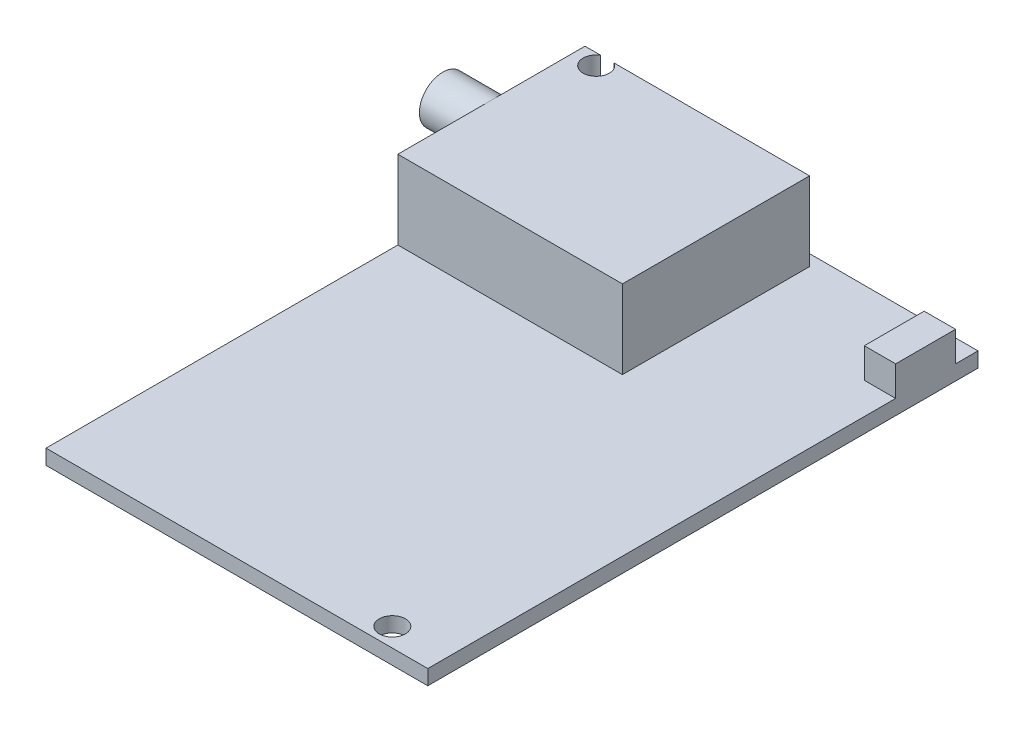
ISO-10303-21;
HEADER;
FILE_DESCRIPTION(('STEP AP214'),'2;1');
FILE_NAME('part.step','',(''),(''),'','','');
FILE_SCHEMA(('AUTOMOTIVE_DESIGN { 1 0 10303 214 1 1 1 1 }'));
ENDSEC;
DATA;
#1=APPLICATION_CONTEXT('core data for automotive mechanical design processes');
#2=APPLICATION_PROTOCOL_DEFINITION('international standard','automotive_design',2000,#1);
#3=PRODUCT_CONTEXT('',#1,'mechanical');
#4=PRODUCT('Part','Part','',(#3));
#5=PRODUCT_RELATED_PRODUCT_CATEGORY('part','',(#4));
#6=PRODUCT_DEFINITION_FORMATION('','',#4);
#7=PRODUCT_DEFINITION_CONTEXT('part definition',#1,'design');
#8=PRODUCT_DEFINITION('design','',#6,#7);
#9=PRODUCT_DEFINITION_SHAPE('','',#8);
#10=(LENGTH_UNIT() NAMED_UNIT(*) SI_UNIT(.MILLI.,.METRE.));
#11=(NAMED_UNIT(*) PLANE_ANGLE_UNIT() SI_UNIT($,.RADIAN.));
#12=(NAMED_UNIT(*) SI_UNIT($,.STERADIAN.) SOLID_ANGLE_UNIT());
#13=UNCERTAINTY_MEASURE_WITH_UNIT(LENGTH_MEASURE(1.E-05),#10,'distance_accuracy_value','');
#14=(GEOMETRIC_REPRESENTATION_CONTEXT(3) GLOBAL_UNCERTAINTY_ASSIGNED_CONTEXT((#13)) GLOBAL_UNIT_ASSIGNED_CONTEXT((#10,
#11,#12)) REPRESENTATION_CONTEXT('',''));
#15=CARTESIAN_POINT('',(0.,0.,0.));
#16=DIRECTION('',(0.,0.,1.));
#17=DIRECTION('',(1.,0.,0.));
#18=AXIS2_PLACEMENT_3D('',#15,#16,#17);
#19=CARTESIAN_POINT('',(-32.0322361195683,17.5,-55.4267873481913));
#20=DIRECTION('',(0.,0.,-1.));
#21=DIRECTION('',(-1.,0.,0.));
#22=AXIS2_PLACEMENT_3D('',#19,#20,#21);
#23=PLANE('',#22);
#24=DIRECTION('',(0.,1.,0.));
#25=VECTOR('',#24,1.);
#26=CARTESIAN_POINT('',(-29.9336239384343,0.,-55.4267873481913));
#27=LINE('',#26,#25);
#28=CARTESIAN_POINT('',(-29.9336239384343,7.,-55.4267873481913));
#29=VERTEX_POINT('',#28);
#30=CARTESIAN_POINT('',(-29.9336239384343,17.5,-55.4267873481913));
#31=VERTEX_POINT('',#30);
#32=EDGE_CURVE('E48',#29,#31,#27,.T.);
#33=ORIENTED_EDGE('',*,*,#32,.F.);
#34=DIRECTION('',(1.,0.,0.));
#35=VECTOR('',#34,1.);
#36=CARTESIAN_POINT('',(-32.0322361195683,7.,-55.4267873481913));
#37=LINE('',#36,#35);
#38=CARTESIAN_POINT('',(-32.0322361195683,7.,-55.4267873481913));
#39=VERTEX_POINT('',#38);
#40=EDGE_CURVE('E196',#39,#29,#37,.T.);
#41=ORIENTED_EDGE('',*,*,#40,.F.);
#42=DIRECTION('',(0.,-1.,0.));
#43=VECTOR('',#42,1.);
#44=CARTESIAN_POINT('',(-32.0322361195683,17.5,-55.4267873481913));
#45=LINE('',#44,#43);
#46=CARTESIAN_POINT('',(-32.0322361195683,17.5,-55.4267873481913));
#47=VERTEX_POINT('',#46);
#48=EDGE_CURVE('E200',#47,#39,#45,.T.);
#49=ORIENTED_EDGE('',*,*,#48,.F.);
#50=DIRECTION('',(1.,0.,0.));
#51=VECTOR('',#50,1.);
#52=CARTESIAN_POINT('',(-32.0322361195683,17.5,-55.4267873481913));
#53=LINE('',#52,#51);
#54=EDGE_CURVE('E179',#47,#31,#53,.T.);
#55=ORIENTED_EDGE('',*,*,#54,.T.);
#56=EDGE_LOOP('',(#33,#41,#49,#55));
#57=FACE_BOUND('',#56,.T.);
#58=ADVANCED_FACE('F33',(#57),#23,.T.);
#59=CARTESIAN_POINT('',(0.,7.,0.));
#60=DIRECTION('',(0.,1.,0.));
#61=DIRECTION('',(0.,0.,1.));
#62=AXIS2_PLACEMENT_3D('',#59,#60,#61);
#63=PLANE('',#62);
#64=CARTESIAN_POINT('',(-29.0322361195683,7.,-53.9267873481913));
#65=DIRECTION('',(0.,1.,0.));
#66=DIRECTION('',(0.,0.,1.));
#67=AXIS2_PLACEMENT_3D('',#64,#65,#66);
#68=CIRCLE('',#67,1.75);
#69=CARTESIAN_POINT('',(-28.1308483007023,7.,-55.4267873481913));
#70=VERTEX_POINT('',#69);
#71=EDGE_CURVE('E173',#70,#29,#68,.T.);
#72=ORIENTED_EDGE('',*,*,#71,.F.);
#73=CARTESIAN_POINT('',(-2.03223611956834,7.,-55.4267873481913));
#74=VERTEX_POINT('',#73);
#75=EDGE_CURVE('E172',#70,#74,#37,.T.);
#76=ORIENTED_EDGE('',*,*,#75,.T.);
#77=DIRECTION('',(0.,0.,1.));
#78=VECTOR('',#77,1.);
#79=CARTESIAN_POINT('',(-2.03223611956834,7.,-55.4267873481913));
#80=LINE('',#79,#78);
#81=CARTESIAN_POINT('',(-2.03223611956834,7.,-30.4267873481913));
#82=VERTEX_POINT('',#81);
#83=EDGE_CURVE('E183',#74,#82,#80,.T.);
#84=ORIENTED_EDGE('',*,*,#83,.T.);
#85=DIRECTION('',(1.,0.,0.));
#86=VECTOR('',#85,1.);
#87=CARTESIAN_POINT('',(-32.0322361195683,7.,-30.4267873481913));
#88=LINE('',#87,#86);
#89=CARTESIAN_POINT('',(-32.0322361195683,7.,-30.4267873481913));
#90=VERTEX_POINT('',#89);
#91=EDGE_CURVE('E180',#90,#82,#88,.T.);
#92=ORIENTED_EDGE('',*,*,#91,.F.);
#93=DIRECTION('',(0.,0.,1.));
#94=VECTOR('',#93,1.);
#95=CARTESIAN_POINT('',(-32.0322361195683,7.,-56.9267873481913));
#96=LINE('',#95,#94);
#97=CARTESIAN_POINT('',(-32.0322361195683,7.,16.5732126518087));
#98=VERTEX_POINT('',#97);
#99=EDGE_CURVE('E216',#90,#98,#96,.T.);
#100=ORIENTED_EDGE('',*,*,#99,.T.);
#101=DIRECTION('',(1.,0.,0.));
#102=VECTOR('',#101,1.);
#103=CARTESIAN_POINT('',(-32.0322361195683,7.,16.5732126518087));
#104=LINE('',#103,#102);
#105=CARTESIAN_POINT('',(18.9677638804317,7.,16.5732126518087));
#106=VERTEX_POINT('',#105);
#107=EDGE_CURVE('E219',#98,#106,#104,.T.);
#108=ORIENTED_EDGE('',*,*,#107,.T.);
#109=DIRECTION('',(0.,0.,-1.));
#110=VECTOR('',#109,1.);
#111=CARTESIAN_POINT('',(18.9677638804317,7.,-56.9267873481913));
#112=LINE('',#111,#110);
#113=CARTESIAN_POINT('',(18.9677638804317,7.,-45.9267873481913));
#114=VERTEX_POINT('',#113);
#115=EDGE_CURVE('E211',#106,#114,#112,.T.);
#116=ORIENTED_EDGE('',*,*,#115,.T.);
#117=DIRECTION('',(1.,0.,0.));
#118=VECTOR('',#117,1.);
#119=CARTESIAN_POINT('',(18.9677638804317,7.,-45.9267873481913));
#120=LINE('',#119,#118);
#121=CARTESIAN_POINT('',(14.7784979766104,7.,-45.9267873481913));
#122=VERTEX_POINT('',#121);
#123=EDGE_CURVE('E55',#122,#114,#120,.T.);
#124=ORIENTED_EDGE('',*,*,#123,.F.);
#125=DIRECTION('',(0.,0.,1.));
#126=VECTOR('',#125,1.);
#127=CARTESIAN_POINT('',(14.7784979766104,7.,-53.9267873481913));
#128=LINE('',#127,#126);
#129=CARTESIAN_POINT('',(14.7784979766104,7.,-53.9267873481913));
#130=VERTEX_POINT('',#129);
#131=EDGE_CURVE('E279',#130,#122,#128,.T.);
#132=ORIENTED_EDGE('',*,*,#131,.F.);
#133=DIRECTION('',(-1.,0.,0.));
#134=VECTOR('',#133,1.);
#135=CARTESIAN_POINT('',(18.9677638804317,7.,-53.9267873481913));
#136=LINE('',#135,#134);
#137=CARTESIAN_POINT('',(18.9677638804317,7.,-53.9267873481913));
#138=VERTEX_POINT('',#137);
#139=EDGE_CURVE('E292',#138,#130,#136,.T.);
#140=ORIENTED_EDGE('',*,*,#139,.F.);
#141=CARTESIAN_POINT('',(18.9677638804317,7.,-56.9267873481913));
#142=VERTEX_POINT('',#141);
#143=EDGE_CURVE('E214',#138,#142,#112,.T.);
#144=ORIENTED_EDGE('',*,*,#143,.T.);
#145=DIRECTION('',(-1.,0.,0.));
#146=VECTOR('',#145,1.);
#147=CARTESIAN_POINT('',(-32.0322361195683,7.,-56.9267873481913));
#148=LINE('',#147,#146);
#149=CARTESIAN_POINT('',(-32.0322361195683,7.,-56.9267873481913));
#150=VERTEX_POINT('',#149);
#151=EDGE_CURVE('E213',#142,#150,#148,.T.);
#152=ORIENTED_EDGE('',*,*,#151,.T.);
#153=EDGE_CURVE('E217',#150,#39,#96,.T.);
#154=ORIENTED_EDGE('',*,*,#153,.T.);
#155=ORIENTED_EDGE('',*,*,#40,.T.);
#156=EDGE_LOOP('',(#72,#76,#84,#92,#100,#108,#116,#124,#132,#140,#144,#152,#154,#155));
#157=FACE_BOUND('',#156,.T.);
#158=CARTESIAN_POINT('',(11.7177638804317,7.,14.0632126518087));
#159=DIRECTION('',(0.,1.,0.));
#160=DIRECTION('',(0.,0.,1.));
#161=AXIS2_PLACEMENT_3D('',#158,#159,#160);
#162=CIRCLE('',#161,1.75);
#163=CARTESIAN_POINT('',(11.7177638804317,7.,15.8132126518087));
#164=VERTEX_POINT('',#163);
#165=EDGE_CURVE('E274',#164,#164,#162,.T.);
#166=ORIENTED_EDGE('',*,*,#165,.F.);
#167=EDGE_LOOP('',(#166));
#168=FACE_BOUND('',#167,.T.);
#169=ADVANCED_FACE('F334',(#157,#168),#63,.T.);
#170=CARTESIAN_POINT('',(-13.0644722391366,5.,-20.1767873481913));
#171=DIRECTION('',(1.,0.,0.));
#172=DIRECTION('',(0.,0.,-1.));
#173=AXIS2_PLACEMENT_3D('',#170,#171,#172);
#174=PLANE('',#173);
#175=DIRECTION('',(0.,0.,1.));
#176=VECTOR('',#175,1.);
#177=CARTESIAN_POINT('',(-13.0644722391366,0.,-20.1767873481913));
#178=LINE('',#177,#176);
#179=CARTESIAN_POINT('',(-13.0644722391366,0.,-20.1767873481913));
#180=VERTEX_POINT('',#179);
#181=CARTESIAN_POINT('',(-13.0644722391366,0.,0.));
#182=VERTEX_POINT('',#181);
#183=EDGE_CURVE('E241',#180,#182,#178,.T.);
#184=ORIENTED_EDGE('',*,*,#183,.T.);
#185=DIRECTION('',(0.,-1.,0.));
#186=VECTOR('',#185,1.);
#187=CARTESIAN_POINT('',(-13.0644722391366,5.,0.));
#188=LINE('',#187,#186);
#189=CARTESIAN_POINT('',(-13.0644722391366,5.,0.));
#190=VERTEX_POINT('',#189);
#191=EDGE_CURVE('E41',#190,#182,#188,.T.);
#192=ORIENTED_EDGE('',*,*,#191,.F.);
#193=DIRECTION('',(0.,0.,1.));
#194=VECTOR('',#193,1.);
#195=CARTESIAN_POINT('',(-13.0644722391366,5.,-20.1767873481913));
#196=LINE('',#195,#194);
#197=CARTESIAN_POINT('',(-13.0644722391366,5.,-20.1767873481913));
#198=VERTEX_POINT('',#197);
#199=EDGE_CURVE('E242',#198,#190,#196,.T.);
#200=ORIENTED_EDGE('',*,*,#199,.F.);
#201=DIRECTION('',(0.,-1.,0.));
#202=VECTOR('',#201,1.);
#203=CARTESIAN_POINT('',(-13.0644722391366,5.,-20.1767873481913));
#204=LINE('',#203,#202);
#205=EDGE_CURVE('E255',#198,#180,#204,.T.);
#206=ORIENTED_EDGE('',*,*,#205,.T.);
#207=EDGE_LOOP('',(#184,#192,#200,#206));
#208=FACE_BOUND('',#207,.T.);
#209=ADVANCED_FACE('F35',(#208),#174,.F.);
#210=CARTESIAN_POINT('',(-13.0644722391366,5.,0.));
#211=DIRECTION('',(0.,0.,-1.));
#212=DIRECTION('',(-1.,0.,0.));
#213=AXIS2_PLACEMENT_3D('',#210,#211,#212);
#214=PLANE('',#213);
#215=DIRECTION('',(1.,0.,0.));
#216=VECTOR('',#215,1.);
#217=CARTESIAN_POINT('',(-13.0644722391366,0.,0.));
#218=LINE('',#217,#216);
#219=CARTESIAN_POINT('',(0.,0.,0.));
#220=VERTEX_POINT('',#219);
#221=EDGE_CURVE('E258',#182,#220,#218,.T.);
#222=ORIENTED_EDGE('',*,*,#221,.T.);
#223=DIRECTION('',(0.,-1.,0.));
#224=VECTOR('',#223,1.);
#225=CARTESIAN_POINT('',(0.,5.,0.));
#226=LINE('',#225,#224);
#227=CARTESIAN_POINT('',(0.,5.,0.));
#228=VERTEX_POINT('',#227);
#229=EDGE_CURVE('E268',#228,#220,#226,.T.);
#230=ORIENTED_EDGE('',*,*,#229,.F.);
#231=DIRECTION('',(1.,0.,0.));
#232=VECTOR('',#231,1.);
#233=CARTESIAN_POINT('',(-13.0644722391366,5.,0.));
#234=LINE('',#233,#232);
#235=EDGE_CURVE('E245',#190,#228,#234,.T.);
#236=ORIENTED_EDGE('',*,*,#235,.F.);
#237=ORIENTED_EDGE('',*,*,#191,.T.);
#238=EDGE_LOOP('',(#222,#230,#236,#237));
#239=FACE_BOUND('',#238,.T.);
#240=ADVANCED_FACE('F401',(#239),#214,.F.);
#241=CARTESIAN_POINT('',(0.,5.,-20.1767873481913));
#242=DIRECTION('',(-1.,0.,0.));
#243=DIRECTION('',(0.,0.,1.));
#244=AXIS2_PLACEMENT_3D('',#241,#242,#243);
#245=PLANE('',#244);
#246=DIRECTION('',(0.,0.,-1.));
#247=VECTOR('',#246,1.);
#248=CARTESIAN_POINT('',(0.,0.,-20.1767873481913));
#249=LINE('',#248,#247);
#250=CARTESIAN_POINT('',(0.,0.,-20.1767873481913));
#251=VERTEX_POINT('',#250);
#252=EDGE_CURVE('E260',#220,#251,#249,.T.);
#253=ORIENTED_EDGE('',*,*,#252,.T.);
#254=DIRECTION('',(0.,-1.,0.));
#255=VECTOR('',#254,1.);
#256=CARTESIAN_POINT('',(0.,5.,-20.1767873481913));
#257=LINE('',#256,#255);
#258=CARTESIAN_POINT('',(0.,5.,-20.1767873481913));
#259=VERTEX_POINT('',#258);
#260=EDGE_CURVE('E265',#259,#251,#257,.T.);
#261=ORIENTED_EDGE('',*,*,#260,.F.);
#262=DIRECTION('',(0.,0.,-1.));
#263=VECTOR('',#262,1.);
#264=CARTESIAN_POINT('',(0.,5.,-20.1767873481913));
#265=LINE('',#264,#263);
#266=EDGE_CURVE('E249',#228,#259,#265,.T.);
#267=ORIENTED_EDGE('',*,*,#266,.F.);
#268=ORIENTED_EDGE('',*,*,#229,.T.);
#269=EDGE_LOOP('',(#253,#261,#267,#268));
#270=FACE_BOUND('',#269,.T.);
#271=ADVANCED_FACE('F398',(#270),#245,.F.);
#272=CARTESIAN_POINT('',(-13.0644722391366,5.,-20.1767873481913));
#273=DIRECTION('',(0.,0.,1.));
#274=DIRECTION('',(1.,0.,0.));
#275=AXIS2_PLACEMENT_3D('',#272,#273,#274);
#276=PLANE('',#275);
#277=DIRECTION('',(-1.,0.,0.));
#278=VECTOR('',#277,1.);
#279=CARTESIAN_POINT('',(-13.0644722391366,0.,-20.1767873481913));
#280=LINE('',#279,#278);
#281=EDGE_CURVE('E246',#251,#180,#280,.T.);
#282=ORIENTED_EDGE('',*,*,#281,.T.);
#283=ORIENTED_EDGE('',*,*,#205,.F.);
#284=DIRECTION('',(-1.,0.,0.));
#285=VECTOR('',#284,1.);
#286=CARTESIAN_POINT('',(-13.0644722391366,5.,-20.1767873481913));
#287=LINE('',#286,#285);
#288=EDGE_CURVE('E252',#259,#198,#287,.T.);
#289=ORIENTED_EDGE('',*,*,#288,.F.);
#290=ORIENTED_EDGE('',*,*,#260,.T.);
#291=EDGE_LOOP('',(#282,#283,#289,#290));
#292=FACE_BOUND('',#291,.T.);
#293=ADVANCED_FACE('F394',(#292),#276,.F.);
#294=CARTESIAN_POINT('',(0.,0.,0.));
#295=DIRECTION('',(0.,1.,0.));
#296=DIRECTION('',(0.,0.,1.));
#297=AXIS2_PLACEMENT_3D('',#294,#295,#296);
#298=PLANE('',#297);
#299=ORIENTED_EDGE('',*,*,#183,.F.);
#300=ORIENTED_EDGE('',*,*,#281,.F.);
#301=ORIENTED_EDGE('',*,*,#252,.F.);
#302=ORIENTED_EDGE('',*,*,#221,.F.);
#303=EDGE_LOOP('',(#299,#300,#301,#302));
#304=FACE_BOUND('',#303,.T.);
#305=ADVANCED_FACE('F391',(#304),#298,.F.);
#306=CARTESIAN_POINT('',(0.,5.,0.));
#307=DIRECTION('',(0.,1.,0.));
#308=DIRECTION('',(0.,0.,1.));
#309=AXIS2_PLACEMENT_3D('',#306,#307,#308);
#310=PLANE('',#309);
#311=CARTESIAN_POINT('',(-29.0322361195683,5.,-53.9267873481913));
#312=DIRECTION('',(0.,1.,0.));
#313=DIRECTION('',(0.,0.,1.));
#314=AXIS2_PLACEMENT_3D('',#311,#312,#313);
#315=CIRCLE('',#314,1.75);
#316=CARTESIAN_POINT('',(-29.0322361195683,5.,-52.1767873481913));
#317=VERTEX_POINT('',#316);
#318=EDGE_CURVE('E275',#317,#317,#315,.T.);
#319=ORIENTED_EDGE('',*,*,#318,.T.);
#320=EDGE_LOOP('',(#319));
#321=FACE_BOUND('',#320,.T.);
#322=CARTESIAN_POINT('',(11.7177638804317,5.,14.0632126518087));
#323=DIRECTION('',(0.,1.,0.));
#324=DIRECTION('',(0.,0.,1.));
#325=AXIS2_PLACEMENT_3D('',#322,#323,#324);
#326=CIRCLE('',#325,1.75);
#327=CARTESIAN_POINT('',(11.7177638804317,5.,15.8132126518087));
#328=VERTEX_POINT('',#327);
#329=EDGE_CURVE('E272',#328,#328,#326,.T.);
#330=ORIENTED_EDGE('',*,*,#329,.T.);
#331=EDGE_LOOP('',(#330));
#332=FACE_BOUND('',#331,.T.);
#333=DIRECTION('',(0.,0.,-1.));
#334=VECTOR('',#333,1.);
#335=CARTESIAN_POINT('',(18.9677638804317,5.,-56.9267873481913));
#336=LINE('',#335,#334);
#337=CARTESIAN_POINT('',(18.9677638804317,5.,16.5732126518087));
#338=VERTEX_POINT('',#337);
#339=CARTESIAN_POINT('',(18.9677638804317,5.,-56.9267873481913));
#340=VERTEX_POINT('',#339);
#341=EDGE_CURVE('E203',#338,#340,#336,.T.);
#342=ORIENTED_EDGE('',*,*,#341,.F.);
#343=DIRECTION('',(1.,0.,0.));
#344=VECTOR('',#343,1.);
#345=CARTESIAN_POINT('',(-32.0322361195683,5.,16.5732126518087));
#346=LINE('',#345,#344);
#347=CARTESIAN_POINT('',(-32.0322361195683,5.,16.5732126518087));
#348=VERTEX_POINT('',#347);
#349=EDGE_CURVE('E228',#348,#338,#346,.T.);
#350=ORIENTED_EDGE('',*,*,#349,.F.);
#351=DIRECTION('',(0.,0.,1.));
#352=VECTOR('',#351,1.);
#353=CARTESIAN_POINT('',(-32.0322361195683,5.,-56.9267873481913));
#354=LINE('',#353,#352);
#355=CARTESIAN_POINT('',(-32.0322361195683,5.,-56.9267873481913));
#356=VERTEX_POINT('',#355);
#357=EDGE_CURVE('E226',#356,#348,#354,.T.);
#358=ORIENTED_EDGE('',*,*,#357,.F.);
#359=DIRECTION('',(-1.,0.,0.));
#360=VECTOR('',#359,1.);
#361=CARTESIAN_POINT('',(-32.0322361195683,5.,-56.9267873481913));
#362=LINE('',#361,#360);
#363=EDGE_CURVE('E224',#340,#356,#362,.T.);
#364=ORIENTED_EDGE('',*,*,#363,.F.);
#365=EDGE_LOOP('',(#342,#350,#358,#364));
#366=FACE_BOUND('',#365,.T.);
#367=ORIENTED_EDGE('',*,*,#288,.T.);
#368=ORIENTED_EDGE('',*,*,#199,.T.);
#369=ORIENTED_EDGE('',*,*,#235,.T.);
#370=ORIENTED_EDGE('',*,*,#266,.T.);
#371=EDGE_LOOP('',(#367,#368,#369,#370));
#372=FACE_BOUND('',#371,.T.);
#373=ADVANCED_FACE('F343',(#321,#332,#366,#372),#310,.F.);
#374=CARTESIAN_POINT('',(18.9677638804317,7.,-56.9267873481913));
#375=DIRECTION('',(-1.,0.,0.));
#376=DIRECTION('',(0.,0.,1.));
#377=AXIS2_PLACEMENT_3D('',#374,#375,#376);
#378=PLANE('',#377);
#379=ORIENTED_EDGE('',*,*,#341,.T.);
#380=DIRECTION('',(0.,-1.,0.));
#381=VECTOR('',#380,1.);
#382=CARTESIAN_POINT('',(18.9677638804317,7.,-56.9267873481913));
#383=LINE('',#382,#381);
#384=EDGE_CURVE('E238',#142,#340,#383,.T.);
#385=ORIENTED_EDGE('',*,*,#384,.F.);
#386=ORIENTED_EDGE('',*,*,#143,.F.);
#387=DIRECTION('',(0.,-1.,0.));
#388=VECTOR('',#387,1.);
#389=CARTESIAN_POINT('',(18.9677638804317,11.,-53.9267873481913));
#390=LINE('',#389,#388);
#391=CARTESIAN_POINT('',(18.9677638804317,11.,-53.9267873481913));
#392=VERTEX_POINT('',#391);
#393=EDGE_CURVE('E306',#392,#138,#390,.T.);
#394=ORIENTED_EDGE('',*,*,#393,.F.);
#395=DIRECTION('',(0.,0.,-1.));
#396=VECTOR('',#395,1.);
#397=CARTESIAN_POINT('',(18.9677638804317,11.,-53.9267873481913));
#398=LINE('',#397,#396);
#399=CARTESIAN_POINT('',(18.9677638804317,11.,-45.9267873481913));
#400=VERTEX_POINT('',#399);
#401=EDGE_CURVE('E294',#400,#392,#398,.T.);
#402=ORIENTED_EDGE('',*,*,#401,.F.);
#403=DIRECTION('',(0.,-1.,0.));
#404=VECTOR('',#403,1.);
#405=CARTESIAN_POINT('',(18.9677638804317,11.,-45.9267873481913));
#406=LINE('',#405,#404);
#407=EDGE_CURVE('E309',#400,#114,#406,.T.);
#408=ORIENTED_EDGE('',*,*,#407,.T.);
#409=ORIENTED_EDGE('',*,*,#115,.F.);
#410=DIRECTION('',(0.,-1.,0.));
#411=VECTOR('',#410,1.);
#412=CARTESIAN_POINT('',(18.9677638804317,7.,16.5732126518087));
#413=LINE('',#412,#411);
#414=EDGE_CURVE('E221',#106,#338,#413,.T.);
#415=ORIENTED_EDGE('',*,*,#414,.T.);
#416=EDGE_LOOP('',(#379,#385,#386,#394,#402,#408,#409,#415));
#417=FACE_BOUND('',#416,.T.);
#418=ADVANCED_FACE('F387',(#417),#378,.F.);
#419=CARTESIAN_POINT('',(-32.0322361195683,7.,-56.9267873481913));
#420=DIRECTION('',(0.,0.,1.));
#421=DIRECTION('',(1.,0.,0.));
#422=AXIS2_PLACEMENT_3D('',#419,#420,#421);
#423=PLANE('',#422);
#424=ORIENTED_EDGE('',*,*,#363,.T.);
#425=DIRECTION('',(0.,-1.,0.));
#426=VECTOR('',#425,1.);
#427=CARTESIAN_POINT('',(-32.0322361195683,7.,-56.9267873481913));
#428=LINE('',#427,#426);
#429=EDGE_CURVE('E235',#150,#356,#428,.T.);
#430=ORIENTED_EDGE('',*,*,#429,.F.);
#431=ORIENTED_EDGE('',*,*,#151,.F.);
#432=ORIENTED_EDGE('',*,*,#384,.T.);
#433=EDGE_LOOP('',(#424,#430,#431,#432));
#434=FACE_BOUND('',#433,.T.);
#435=ADVANCED_FACE('F340',(#434),#423,.F.);
#436=CARTESIAN_POINT('',(-32.0322361195683,7.,-56.9267873481913));
#437=DIRECTION('',(1.,0.,0.));
#438=DIRECTION('',(0.,0.,-1.));
#439=AXIS2_PLACEMENT_3D('',#436,#437,#438);
#440=PLANE('',#439);
#441=DIRECTION('',(0.,0.,1.));
#442=VECTOR('',#441,1.);
#443=CARTESIAN_POINT('',(-32.0322361195683,17.5,-55.4267873481913));
#444=LINE('',#443,#442);
#445=CARTESIAN_POINT('',(-32.0322361195683,17.5,-42.9267873481913));
#446=VERTEX_POINT('',#445);
#447=CARTESIAN_POINT('',(-32.0322361195683,17.5,-30.4267873481913));
#448=VERTEX_POINT('',#447);
#449=EDGE_CURVE('E192',#446,#448,#444,.T.);
#450=ORIENTED_EDGE('',*,*,#449,.F.);
#451=CARTESIAN_POINT('',(-32.0322361195683,14.375,-42.9267873481913));
#452=DIRECTION('',(-1.,0.,0.));
#453=DIRECTION('',(0.,0.,1.));
#454=AXIS2_PLACEMENT_3D('',#451,#452,#453);
#455=CIRCLE('',#454,3.125);
#456=EDGE_CURVE('E187',#446,#446,#455,.T.);
#457=ORIENTED_EDGE('',*,*,#456,.F.);
#458=EDGE_CURVE('E193',#47,#446,#444,.T.);
#459=ORIENTED_EDGE('',*,*,#458,.F.);
#460=ORIENTED_EDGE('',*,*,#48,.T.);
#461=ORIENTED_EDGE('',*,*,#153,.F.);
#462=ORIENTED_EDGE('',*,*,#429,.T.);
#463=ORIENTED_EDGE('',*,*,#357,.T.);
#464=DIRECTION('',(0.,-1.,0.));
#465=VECTOR('',#464,1.);
#466=CARTESIAN_POINT('',(-32.0322361195683,7.,16.5732126518087));
#467=LINE('',#466,#465);
#468=EDGE_CURVE('E232',#98,#348,#467,.T.);
#469=ORIENTED_EDGE('',*,*,#468,.F.);
#470=ORIENTED_EDGE('',*,*,#99,.F.);
#471=DIRECTION('',(0.,-1.,0.));
#472=VECTOR('',#471,1.);
#473=CARTESIAN_POINT('',(-32.0322361195683,17.5,-30.4267873481913));
#474=LINE('',#473,#472);
#475=EDGE_CURVE('E204',#448,#90,#474,.T.);
#476=ORIENTED_EDGE('',*,*,#475,.F.);
#477=EDGE_LOOP('',(#450,#457,#459,#460,#461,#462,#463,#469,#470,#476));
#478=FACE_BOUND('',#477,.T.);
#479=ADVANCED_FACE('F324',(#478),#440,.F.);
#480=CARTESIAN_POINT('',(-32.0322361195683,7.,16.5732126518087));
#481=DIRECTION('',(0.,0.,-1.));
#482=DIRECTION('',(-1.,0.,0.));
#483=AXIS2_PLACEMENT_3D('',#480,#481,#482);
#484=PLANE('',#483);
#485=ORIENTED_EDGE('',*,*,#349,.T.);
#486=ORIENTED_EDGE('',*,*,#414,.F.);
#487=ORIENTED_EDGE('',*,*,#107,.F.);
#488=ORIENTED_EDGE('',*,*,#468,.T.);
#489=EDGE_LOOP('',(#485,#486,#487,#488));
#490=FACE_BOUND('',#489,.T.);
#491=ADVANCED_FACE('F349',(#490),#484,.F.);
#492=DIRECTION('',(0.,1.,0.));
#493=VECTOR('',#492,1.);
#494=CARTESIAN_POINT('',(-28.1308483007023,0.,-55.4267873481913));
#495=LINE('',#494,#493);
#496=CARTESIAN_POINT('',(-28.1308483007023,17.5,-55.4267873481913));
#497=VERTEX_POINT('',#496);
#498=EDGE_CURVE('E160',#497,#70,#495,.F.);
#499=ORIENTED_EDGE('',*,*,#498,.F.);
#500=CARTESIAN_POINT('',(-2.03223611956834,17.5,-55.4267873481913));
#501=VERTEX_POINT('',#500);
#502=EDGE_CURVE('E170',#497,#501,#53,.T.);
#503=ORIENTED_EDGE('',*,*,#502,.T.);
#504=DIRECTION('',(0.,-1.,0.));
#505=VECTOR('',#504,1.);
#506=CARTESIAN_POINT('',(-2.03223611956834,17.5,-55.4267873481913));
#507=LINE('',#506,#505);
#508=EDGE_CURVE('E195',#501,#74,#507,.T.);
#509=ORIENTED_EDGE('',*,*,#508,.T.);
#510=ORIENTED_EDGE('',*,*,#75,.F.);
#511=EDGE_LOOP('',(#499,#503,#509,#510));
#512=FACE_BOUND('',#511,.T.);
#513=ADVANCED_FACE('F168',(#512),#23,.T.);
#514=CARTESIAN_POINT('',(-32.0322361195683,17.5,-30.4267873481913));
#515=DIRECTION('',(0.,0.,-1.));
#516=DIRECTION('',(-1.,0.,0.));
#517=AXIS2_PLACEMENT_3D('',#514,#515,#516);
#518=PLANE('',#517);
#519=ORIENTED_EDGE('',*,*,#91,.T.);
#520=DIRECTION('',(0.,-1.,0.));
#521=VECTOR('',#520,1.);
#522=CARTESIAN_POINT('',(-2.03223611956834,17.5,-30.4267873481913));
#523=LINE('',#522,#521);
#524=CARTESIAN_POINT('',(-2.03223611956834,17.5,-30.4267873481913));
#525=VERTEX_POINT('',#524);
#526=EDGE_CURVE('E207',#525,#82,#523,.T.);
#527=ORIENTED_EDGE('',*,*,#526,.F.);
#528=DIRECTION('',(1.,0.,0.));
#529=VECTOR('',#528,1.);
#530=CARTESIAN_POINT('',(-32.0322361195683,17.5,-30.4267873481913));
#531=LINE('',#530,#529);
#532=EDGE_CURVE('E190',#448,#525,#531,.T.);
#533=ORIENTED_EDGE('',*,*,#532,.F.);
#534=ORIENTED_EDGE('',*,*,#475,.T.);
#535=EDGE_LOOP('',(#519,#527,#533,#534));
#536=FACE_BOUND('',#535,.T.);
#537=ADVANCED_FACE('F353',(#536),#518,.F.);
#538=CARTESIAN_POINT('',(-2.03223611956834,17.5,-55.4267873481913));
#539=DIRECTION('',(1.,0.,0.));
#540=DIRECTION('',(0.,0.,-1.));
#541=AXIS2_PLACEMENT_3D('',#538,#539,#540);
#542=PLANE('',#541);
#543=ORIENTED_EDGE('',*,*,#83,.F.);
#544=ORIENTED_EDGE('',*,*,#508,.F.);
#545=DIRECTION('',(0.,0.,1.));
#546=VECTOR('',#545,1.);
#547=CARTESIAN_POINT('',(-2.03223611956834,17.5,-55.4267873481913));
#548=LINE('',#547,#546);
#549=EDGE_CURVE('E178',#501,#525,#548,.T.);
#550=ORIENTED_EDGE('',*,*,#549,.T.);
#551=ORIENTED_EDGE('',*,*,#526,.T.);
#552=EDGE_LOOP('',(#543,#544,#550,#551));
#553=FACE_BOUND('',#552,.T.);
#554=ADVANCED_FACE('F356',(#553),#542,.T.);
#555=CARTESIAN_POINT('',(0.,17.5,0.));
#556=DIRECTION('',(0.,-1.,0.));
#557=DIRECTION('',(0.,0.,-1.));
#558=AXIS2_PLACEMENT_3D('',#555,#556,#557);
#559=PLANE('',#558);
#560=ORIENTED_EDGE('',*,*,#502,.F.);
#561=CARTESIAN_POINT('',(-29.0322361195683,17.5,-53.9267873481913));
#562=DIRECTION('',(0.,-1.,0.));
#563=DIRECTION('',(0.,0.,-1.));
#564=AXIS2_PLACEMENT_3D('',#561,#562,#563);
#565=CIRCLE('',#564,1.75);
#566=EDGE_CURVE('E11',#497,#31,#565,.T.);
#567=ORIENTED_EDGE('',*,*,#566,.T.);
#568=ORIENTED_EDGE('',*,*,#54,.F.);
#569=ORIENTED_EDGE('',*,*,#458,.T.);
#570=ORIENTED_EDGE('',*,*,#449,.T.);
#571=ORIENTED_EDGE('',*,*,#532,.T.);
#572=ORIENTED_EDGE('',*,*,#549,.F.);
#573=EDGE_LOOP('',(#560,#567,#568,#569,#570,#571,#572));
#574=FACE_BOUND('',#573,.T.);
#575=ADVANCED_FACE('F176',(#574),#559,.F.);
#576=CARTESIAN_POINT('',(-38.5322361195683,14.375,-42.9267873481913));
#577=DIRECTION('',(1.,0.,0.));
#578=DIRECTION('',(0.,0.,-1.));
#579=AXIS2_PLACEMENT_3D('',#576,#577,#578);
#580=CYLINDRICAL_SURFACE('',#579,3.125);
#581=CARTESIAN_POINT('',(-38.5322361195683,14.375,-42.9267873481913));
#582=DIRECTION('',(-1.,0.,0.));
#583=DIRECTION('',(0.,0.,1.));
#584=AXIS2_PLACEMENT_3D('',#581,#582,#583);
#585=CIRCLE('',#584,3.125);
#586=CARTESIAN_POINT('',(-38.5322361195683,14.375,-39.8017873481913));
#587=VERTEX_POINT('',#586);
#588=EDGE_CURVE('E313',#587,#587,#585,.T.);
#589=ORIENTED_EDGE('',*,*,#588,.F.);
#590=EDGE_LOOP('',(#589));
#591=FACE_BOUND('',#590,.T.);
#592=ORIENTED_EDGE('',*,*,#456,.T.);
#593=EDGE_LOOP('',(#592));
#594=FACE_BOUND('',#593,.T.);
#595=ADVANCED_FACE('F320',(#591,#594),#580,.T.);
#596=CARTESIAN_POINT('',(-38.5322361195683,14.375,-42.9267873481913));
#597=DIRECTION('',(-1.,0.,0.));
#598=DIRECTION('',(0.,0.,1.));
#599=AXIS2_PLACEMENT_3D('',#596,#597,#598);
#600=PLANE('',#599);
#601=ORIENTED_EDGE('',*,*,#588,.T.);
#602=EDGE_LOOP('',(#601));
#603=FACE_BOUND('',#602,.T.);
#604=ADVANCED_FACE('F488',(#603),#600,.T.);
#605=CARTESIAN_POINT('',(14.7784979766104,11.,-53.9267873481913));
#606=DIRECTION('',(1.,0.,0.));
#607=DIRECTION('',(0.,0.,-1.));
#608=AXIS2_PLACEMENT_3D('',#605,#606,#607);
#609=PLANE('',#608);
#610=ORIENTED_EDGE('',*,*,#131,.T.);
#611=DIRECTION('',(0.,-1.,0.));
#612=VECTOR('',#611,1.);
#613=CARTESIAN_POINT('',(14.7784979766104,11.,-45.9267873481913));
#614=LINE('',#613,#612);
#615=CARTESIAN_POINT('',(14.7784979766104,11.,-45.9267873481913));
#616=VERTEX_POINT('',#615);
#617=EDGE_CURVE('E312',#616,#122,#614,.T.);
#618=ORIENTED_EDGE('',*,*,#617,.F.);
#619=DIRECTION('',(0.,0.,1.));
#620=VECTOR('',#619,1.);
#621=CARTESIAN_POINT('',(14.7784979766104,11.,-53.9267873481913));
#622=LINE('',#621,#620);
#623=CARTESIAN_POINT('',(14.7784979766104,11.,-53.9267873481913));
#624=VERTEX_POINT('',#623);
#625=EDGE_CURVE('E288',#624,#616,#622,.T.);
#626=ORIENTED_EDGE('',*,*,#625,.F.);
#627=DIRECTION('',(0.,-1.,0.));
#628=VECTOR('',#627,1.);
#629=CARTESIAN_POINT('',(14.7784979766104,11.,-53.9267873481913));
#630=LINE('',#629,#628);
#631=EDGE_CURVE('E298',#624,#130,#630,.T.);
#632=ORIENTED_EDGE('',*,*,#631,.T.);
#633=EDGE_LOOP('',(#610,#618,#626,#632));
#634=FACE_BOUND('',#633,.T.);
#635=ADVANCED_FACE('F497',(#634),#609,.F.);
#636=CARTESIAN_POINT('',(18.9677638804317,11.,-45.9267873481913));
#637=DIRECTION('',(0.,0.,-1.));
#638=DIRECTION('',(-1.,0.,0.));
#639=AXIS2_PLACEMENT_3D('',#636,#637,#638);
#640=PLANE('',#639);
#641=ORIENTED_EDGE('',*,*,#123,.T.);
#642=ORIENTED_EDGE('',*,*,#407,.F.);
#643=DIRECTION('',(1.,0.,0.));
#644=VECTOR('',#643,1.);
#645=CARTESIAN_POINT('',(18.9677638804317,11.,-45.9267873481913));
#646=LINE('',#645,#644);
#647=EDGE_CURVE('E291',#616,#400,#646,.T.);
#648=ORIENTED_EDGE('',*,*,#647,.F.);
#649=ORIENTED_EDGE('',*,*,#617,.T.);
#650=EDGE_LOOP('',(#641,#642,#648,#649));
#651=FACE_BOUND('',#650,.T.);
#652=ADVANCED_FACE('F511',(#651),#640,.F.);
#653=CARTESIAN_POINT('',(18.9677638804317,11.,-53.9267873481913));
#654=DIRECTION('',(0.,0.,1.));
#655=DIRECTION('',(1.,0.,0.));
#656=AXIS2_PLACEMENT_3D('',#653,#654,#655);
#657=PLANE('',#656);
#658=ORIENTED_EDGE('',*,*,#139,.T.);
#659=ORIENTED_EDGE('',*,*,#631,.F.);
#660=DIRECTION('',(-1.,0.,0.));
#661=VECTOR('',#660,1.);
#662=CARTESIAN_POINT('',(18.9677638804317,11.,-53.9267873481913));
#663=LINE('',#662,#661);
#664=EDGE_CURVE('E296',#392,#624,#663,.T.);
#665=ORIENTED_EDGE('',*,*,#664,.F.);
#666=ORIENTED_EDGE('',*,*,#393,.T.);
#667=EDGE_LOOP('',(#658,#659,#665,#666));
#668=FACE_BOUND('',#667,.T.);
#669=ADVANCED_FACE('F521',(#668),#657,.F.);
#670=CARTESIAN_POINT('',(0.,11.,0.));
#671=DIRECTION('',(0.,-1.,0.));
#672=DIRECTION('',(0.,0.,-1.));
#673=AXIS2_PLACEMENT_3D('',#670,#671,#672);
#674=PLANE('',#673);
#675=ORIENTED_EDGE('',*,*,#625,.T.);
#676=ORIENTED_EDGE('',*,*,#647,.T.);
#677=ORIENTED_EDGE('',*,*,#401,.T.);
#678=ORIENTED_EDGE('',*,*,#664,.T.);
#679=EDGE_LOOP('',(#675,#676,#677,#678));
#680=FACE_BOUND('',#679,.T.);
#681=ADVANCED_FACE('F530',(#680),#674,.F.);
#682=CARTESIAN_POINT('',(11.7177638804317,0.,14.0632126518087));
#683=DIRECTION('',(0.,1.,0.));
#684=DIRECTION('',(0.,0.,1.));
#685=AXIS2_PLACEMENT_3D('',#682,#683,#684);
#686=CYLINDRICAL_SURFACE('',#685,1.75);
#687=ORIENTED_EDGE('',*,*,#165,.T.);
#688=EDGE_LOOP('',(#687));
#689=FACE_BOUND('',#688,.T.);
#690=ORIENTED_EDGE('',*,*,#329,.F.);
#691=EDGE_LOOP('',(#690));
#692=FACE_BOUND('',#691,.T.);
#693=ADVANCED_FACE('F539',(#689,#692),#686,.F.);
#694=CARTESIAN_POINT('',(-29.0322361195683,0.,-53.9267873481913));
#695=DIRECTION('',(0.,1.,0.));
#696=DIRECTION('',(0.,0.,1.));
#697=AXIS2_PLACEMENT_3D('',#694,#695,#696);
#698=CYLINDRICAL_SURFACE('',#697,1.75);
#699=ORIENTED_EDGE('',*,*,#32,.T.);
#700=ORIENTED_EDGE('',*,*,#566,.F.);
#701=ORIENTED_EDGE('',*,*,#498,.T.);
#702=ORIENTED_EDGE('',*,*,#71,.T.);
#703=EDGE_LOOP('',(#699,#700,#701,#702));
#704=FACE_BOUND('',#703,.T.);
#705=ORIENTED_EDGE('',*,*,#318,.F.);
#706=EDGE_LOOP('',(#705));
#707=FACE_BOUND('',#706,.T.);
#708=ADVANCED_FACE('F158',(#704,#707),#698,.F.);
#709=CLOSED_SHELL('',(#58,#169,#209,#240,#271,#293,#305,#373,#418,#435,#479,#491,#513,#537,#554,
#575,#595,#604,#635,#652,#669,#681,#693,#708));
#710=MANIFOLD_SOLID_BREP('B2',#709);
#711=ADVANCED_BREP_SHAPE_REPRESENTATION('',(#18,#710),#14);
#712=SHAPE_DEFINITION_REPRESENTATION(#9,#711);
ENDSEC;
END-ISO-10303-21;
